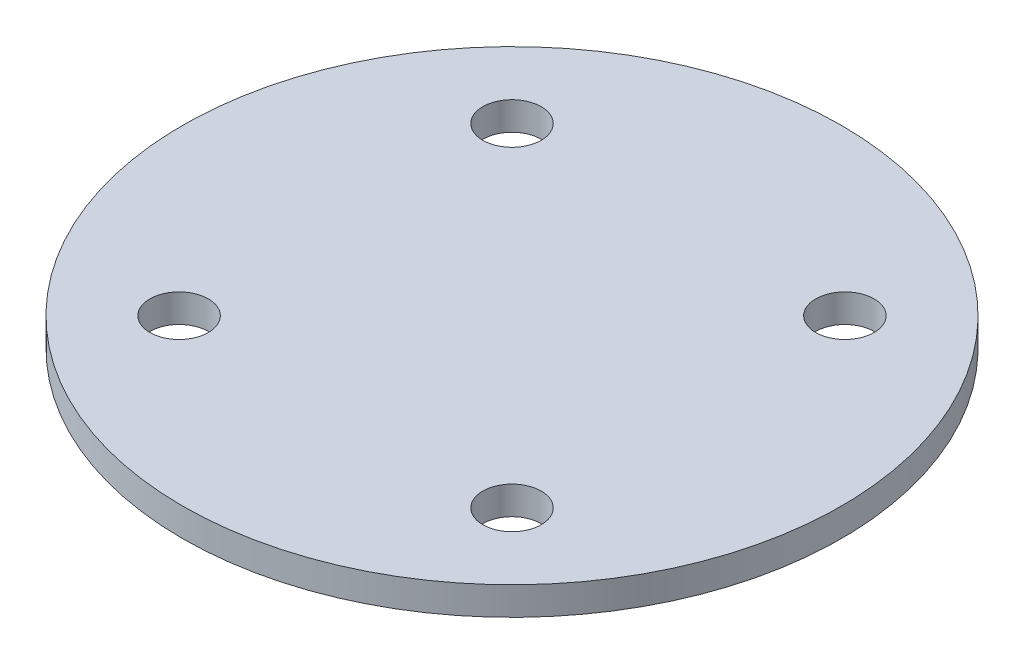
ISO-10303-21;
HEADER;
FILE_DESCRIPTION(('STEP AP214'),'2;1');
FILE_NAME('part.step','',(''),(''),'','','');
FILE_SCHEMA(('AUTOMOTIVE_DESIGN { 1 0 10303 214 1 1 1 1 }'));
ENDSEC;
DATA;
#1=APPLICATION_CONTEXT('core data for automotive mechanical design processes');
#2=APPLICATION_PROTOCOL_DEFINITION('international standard','automotive_design',2000,#1);
#3=PRODUCT_CONTEXT('',#1,'mechanical');
#4=PRODUCT('Part','Part','',(#3));
#5=PRODUCT_RELATED_PRODUCT_CATEGORY('part','',(#4));
#6=PRODUCT_DEFINITION_FORMATION('','',#4);
#7=PRODUCT_DEFINITION_CONTEXT('part definition',#1,'design');
#8=PRODUCT_DEFINITION('design','',#6,#7);
#9=PRODUCT_DEFINITION_SHAPE('','',#8);
#10=(LENGTH_UNIT() NAMED_UNIT(*) SI_UNIT(.MILLI.,.METRE.));
#11=(NAMED_UNIT(*) PLANE_ANGLE_UNIT() SI_UNIT($,.RADIAN.));
#12=(NAMED_UNIT(*) SI_UNIT($,.STERADIAN.) SOLID_ANGLE_UNIT());
#13=UNCERTAINTY_MEASURE_WITH_UNIT(LENGTH_MEASURE(1.E-05),#10,'distance_accuracy_value','');
#14=(GEOMETRIC_REPRESENTATION_CONTEXT(3) GLOBAL_UNCERTAINTY_ASSIGNED_CONTEXT((#13)) GLOBAL_UNIT_ASSIGNED_CONTEXT((#10,
#11,#12)) REPRESENTATION_CONTEXT('',''));
#15=CARTESIAN_POINT('',(0.,0.,0.));
#16=DIRECTION('',(0.,0.,1.));
#17=DIRECTION('',(1.,0.,0.));
#18=AXIS2_PLACEMENT_3D('',#15,#16,#17);
#19=CARTESIAN_POINT('',(0.,5.,0.));
#20=DIRECTION('',(0.,-1.,0.));
#21=DIRECTION('',(0.,0.,-1.));
#22=AXIS2_PLACEMENT_3D('',#19,#20,#21);
#23=CYLINDRICAL_SURFACE('',#22,35.);
#24=CARTESIAN_POINT('',(0.,2.,0.));
#25=DIRECTION('',(0.,1.,0.));
#26=DIRECTION('',(0.,0.,1.));
#27=AXIS2_PLACEMENT_3D('',#24,#25,#26);
#28=CIRCLE('',#27,35.);
#29=CARTESIAN_POINT('',(0.,2.,35.));
#30=VERTEX_POINT('',#29);
#31=EDGE_CURVE('E64',#30,#30,#28,.F.);
#32=ORIENTED_EDGE('',*,*,#31,.F.);
#33=EDGE_LOOP('',(#32));
#34=FACE_BOUND('',#33,.T.);
#35=CARTESIAN_POINT('',(0.,5.,0.));
#36=DIRECTION('',(0.,1.,0.));
#37=DIRECTION('',(0.,0.,1.));
#38=AXIS2_PLACEMENT_3D('',#35,#36,#37);
#39=CIRCLE('',#38,35.);
#40=CARTESIAN_POINT('',(0.,5.,35.));
#41=VERTEX_POINT('',#40);
#42=EDGE_CURVE('E11',#41,#41,#39,.T.);
#43=ORIENTED_EDGE('',*,*,#42,.F.);
#44=EDGE_LOOP('',(#43));
#45=FACE_BOUND('',#44,.T.);
#46=ADVANCED_FACE('F33',(#34,#45),#23,.T.);
#47=CARTESIAN_POINT('',(0.,5.,0.));
#48=DIRECTION('',(0.,1.,0.));
#49=DIRECTION('',(0.,0.,1.));
#50=AXIS2_PLACEMENT_3D('',#47,#48,#49);
#51=PLANE('',#50);
#52=CARTESIAN_POINT('',(-17.6776695296637,5.,17.6776695296638));
#53=DIRECTION('',(0.,1.,0.));
#54=DIRECTION('',(0.,0.,1.));
#55=AXIS2_PLACEMENT_3D('',#52,#53,#54);
#56=CIRCLE('',#55,3.1);
#57=CARTESIAN_POINT('',(-17.6776695296637,5.,20.7776695296638));
#58=VERTEX_POINT('',#57);
#59=EDGE_CURVE('E47',#58,#58,#56,.T.);
#60=ORIENTED_EDGE('',*,*,#59,.F.);
#61=EDGE_LOOP('',(#60));
#62=FACE_BOUND('',#61,.T.);
#63=CARTESIAN_POINT('',(17.6776695296637,5.,17.6776695296638));
#64=DIRECTION('',(0.,1.,0.));
#65=DIRECTION('',(0.,0.,1.));
#66=AXIS2_PLACEMENT_3D('',#63,#64,#65);
#67=CIRCLE('',#66,3.1);
#68=CARTESIAN_POINT('',(17.6776695296637,5.,20.7776695296638));
#69=VERTEX_POINT('',#68);
#70=EDGE_CURVE('E50',#69,#69,#67,.T.);
#71=ORIENTED_EDGE('',*,*,#70,.F.);
#72=EDGE_LOOP('',(#71));
#73=FACE_BOUND('',#72,.T.);
#74=CARTESIAN_POINT('',(17.6776695296637,5.,-17.6776695296636));
#75=DIRECTION('',(0.,1.,0.));
#76=DIRECTION('',(0.,0.,1.));
#77=AXIS2_PLACEMENT_3D('',#74,#75,#76);
#78=CIRCLE('',#77,3.1);
#79=CARTESIAN_POINT('',(17.6776695296637,5.,-14.5776695296636));
#80=VERTEX_POINT('',#79);
#81=EDGE_CURVE('E44',#80,#80,#78,.T.);
#82=ORIENTED_EDGE('',*,*,#81,.F.);
#83=EDGE_LOOP('',(#82));
#84=FACE_BOUND('',#83,.T.);
#85=CARTESIAN_POINT('',(-17.6776695296637,5.,-17.6776695296636));
#86=DIRECTION('',(0.,1.,0.));
#87=DIRECTION('',(0.,0.,1.));
#88=AXIS2_PLACEMENT_3D('',#85,#86,#87);
#89=CIRCLE('',#88,3.1);
#90=CARTESIAN_POINT('',(-17.6776695296637,5.,-14.5776695296636));
#91=VERTEX_POINT('',#90);
#92=EDGE_CURVE('E40',#91,#91,#89,.T.);
#93=ORIENTED_EDGE('',*,*,#92,.F.);
#94=EDGE_LOOP('',(#93));
#95=FACE_BOUND('',#94,.T.);
#96=ORIENTED_EDGE('',*,*,#42,.T.);
#97=EDGE_LOOP('',(#96));
#98=FACE_BOUND('',#97,.T.);
#99=ADVANCED_FACE('F87',(#62,#73,#84,#95,#98),#51,.T.);
#100=CARTESIAN_POINT('',(-17.6776695296637,0.,-17.6776695296636));
#101=DIRECTION('',(0.,1.,0.));
#102=DIRECTION('',(0.,0.,1.));
#103=AXIS2_PLACEMENT_3D('',#100,#101,#102);
#104=CYLINDRICAL_SURFACE('',#103,3.1);
#105=CARTESIAN_POINT('',(-17.6776695296637,2.,-17.6776695296636));
#106=DIRECTION('',(0.,1.,0.));
#107=DIRECTION('',(0.,0.,1.));
#108=AXIS2_PLACEMENT_3D('',#105,#106,#107);
#109=CIRCLE('',#108,3.1);
#110=CARTESIAN_POINT('',(-17.6776695296637,2.,-14.5776695296636));
#111=VERTEX_POINT('',#110);
#112=EDGE_CURVE('E51',#111,#111,#109,.F.);
#113=ORIENTED_EDGE('',*,*,#112,.T.);
#114=EDGE_LOOP('',(#113));
#115=FACE_BOUND('',#114,.T.);
#116=ORIENTED_EDGE('',*,*,#92,.T.);
#117=EDGE_LOOP('',(#116));
#118=FACE_BOUND('',#117,.T.);
#119=ADVANCED_FACE('F83',(#115,#118),#104,.F.);
#120=CARTESIAN_POINT('',(17.6776695296637,0.,-17.6776695296636));
#121=DIRECTION('',(0.,1.,0.));
#122=DIRECTION('',(0.,0.,1.));
#123=AXIS2_PLACEMENT_3D('',#120,#121,#122);
#124=CYLINDRICAL_SURFACE('',#123,3.1);
#125=CARTESIAN_POINT('',(17.6776695296637,2.,-17.6776695296636));
#126=DIRECTION('',(0.,1.,0.));
#127=DIRECTION('',(0.,0.,1.));
#128=AXIS2_PLACEMENT_3D('',#125,#126,#127);
#129=CIRCLE('',#128,3.1);
#130=CARTESIAN_POINT('',(17.6776695296637,2.,-14.5776695296636));
#131=VERTEX_POINT('',#130);
#132=EDGE_CURVE('E58',#131,#131,#129,.F.);
#133=ORIENTED_EDGE('',*,*,#132,.T.);
#134=EDGE_LOOP('',(#133));
#135=FACE_BOUND('',#134,.T.);
#136=ORIENTED_EDGE('',*,*,#81,.T.);
#137=EDGE_LOOP('',(#136));
#138=FACE_BOUND('',#137,.T.);
#139=ADVANCED_FACE('F86',(#135,#138),#124,.F.);
#140=CARTESIAN_POINT('',(17.6776695296637,0.,17.6776695296638));
#141=DIRECTION('',(0.,1.,0.));
#142=DIRECTION('',(0.,0.,1.));
#143=AXIS2_PLACEMENT_3D('',#140,#141,#142);
#144=CYLINDRICAL_SURFACE('',#143,3.1);
#145=CARTESIAN_POINT('',(17.6776695296637,2.,17.6776695296638));
#146=DIRECTION('',(0.,1.,0.));
#147=DIRECTION('',(0.,0.,1.));
#148=AXIS2_PLACEMENT_3D('',#145,#146,#147);
#149=CIRCLE('',#148,3.1);
#150=CARTESIAN_POINT('',(17.6776695296637,2.,20.7776695296638));
#151=VERTEX_POINT('',#150);
#152=EDGE_CURVE('E61',#151,#151,#149,.F.);
#153=ORIENTED_EDGE('',*,*,#152,.T.);
#154=EDGE_LOOP('',(#153));
#155=FACE_BOUND('',#154,.T.);
#156=ORIENTED_EDGE('',*,*,#70,.T.);
#157=EDGE_LOOP('',(#156));
#158=FACE_BOUND('',#157,.T.);
#159=ADVANCED_FACE('F102',(#155,#158),#144,.F.);
#160=CARTESIAN_POINT('',(-17.6776695296637,0.,17.6776695296638));
#161=DIRECTION('',(0.,1.,0.));
#162=DIRECTION('',(0.,0.,1.));
#163=AXIS2_PLACEMENT_3D('',#160,#161,#162);
#164=CYLINDRICAL_SURFACE('',#163,3.1);
#165=CARTESIAN_POINT('',(-17.6776695296637,2.,17.6776695296638));
#166=DIRECTION('',(0.,1.,0.));
#167=DIRECTION('',(0.,0.,1.));
#168=AXIS2_PLACEMENT_3D('',#165,#166,#167);
#169=CIRCLE('',#168,3.1);
#170=CARTESIAN_POINT('',(-17.6776695296637,2.,20.7776695296638));
#171=VERTEX_POINT('',#170);
#172=EDGE_CURVE('E36',#171,#171,#169,.F.);
#173=ORIENTED_EDGE('',*,*,#172,.T.);
#174=EDGE_LOOP('',(#173));
#175=FACE_BOUND('',#174,.T.);
#176=ORIENTED_EDGE('',*,*,#59,.T.);
#177=EDGE_LOOP('',(#176));
#178=FACE_BOUND('',#177,.T.);
#179=ADVANCED_FACE('F71',(#175,#178),#164,.F.);
#180=CARTESIAN_POINT('',(0.,2.,0.));
#181=DIRECTION('',(0.,1.,0.));
#182=DIRECTION('',(0.,0.,1.));
#183=AXIS2_PLACEMENT_3D('',#180,#181,#182);
#184=PLANE('',#183);
#185=ORIENTED_EDGE('',*,*,#132,.F.);
#186=EDGE_LOOP('',(#185));
#187=FACE_BOUND('',#186,.T.);
#188=ORIENTED_EDGE('',*,*,#172,.F.);
#189=EDGE_LOOP('',(#188));
#190=FACE_BOUND('',#189,.T.);
#191=ORIENTED_EDGE('',*,*,#31,.T.);
#192=EDGE_LOOP('',(#191));
#193=FACE_BOUND('',#192,.T.);
#194=ORIENTED_EDGE('',*,*,#152,.F.);
#195=EDGE_LOOP('',(#194));
#196=FACE_BOUND('',#195,.T.);
#197=ORIENTED_EDGE('',*,*,#112,.F.);
#198=EDGE_LOOP('',(#197));
#199=FACE_BOUND('',#198,.T.);
#200=ADVANCED_FACE('F74',(#187,#190,#193,#196,#199),#184,.F.);
#201=CLOSED_SHELL('',(#46,#99,#119,#139,#159,#179,#200));
#202=MANIFOLD_SOLID_BREP('B2',#201);
#203=ADVANCED_BREP_SHAPE_REPRESENTATION('',(#18,#202),#14);
#204=SHAPE_DEFINITION_REPRESENTATION(#9,#203);
ENDSEC;
END-ISO-10303-21;
